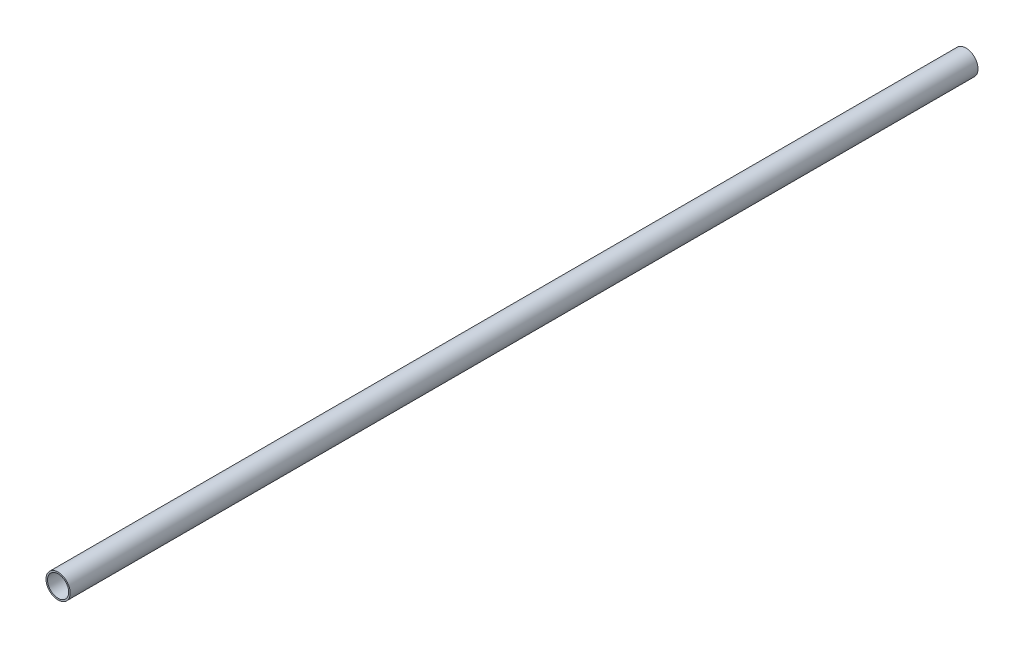
ISO-10303-21;
HEADER;
FILE_DESCRIPTION(('STEP AP214'),'2;1');
FILE_NAME('part.step','',(''),(''),'','','');
FILE_SCHEMA(('AUTOMOTIVE_DESIGN { 1 0 10303 214 1 1 1 1 }'));
ENDSEC;
DATA;
#1=APPLICATION_CONTEXT('core data for automotive mechanical design processes');
#2=APPLICATION_PROTOCOL_DEFINITION('international standard','automotive_design',2000,#1);
#3=PRODUCT_CONTEXT('',#1,'mechanical');
#4=PRODUCT('Part','Part','',(#3));
#5=PRODUCT_RELATED_PRODUCT_CATEGORY('part','',(#4));
#6=PRODUCT_DEFINITION_FORMATION('','',#4);
#7=PRODUCT_DEFINITION_CONTEXT('part definition',#1,'design');
#8=PRODUCT_DEFINITION('design','',#6,#7);
#9=PRODUCT_DEFINITION_SHAPE('','',#8);
#10=(LENGTH_UNIT() NAMED_UNIT(*) SI_UNIT(.MILLI.,.METRE.));
#11=(NAMED_UNIT(*) PLANE_ANGLE_UNIT() SI_UNIT($,.RADIAN.));
#12=(NAMED_UNIT(*) SI_UNIT($,.STERADIAN.) SOLID_ANGLE_UNIT());
#13=UNCERTAINTY_MEASURE_WITH_UNIT(LENGTH_MEASURE(1.E-05),#10,'distance_accuracy_value','');
#14=(GEOMETRIC_REPRESENTATION_CONTEXT(3) GLOBAL_UNCERTAINTY_ASSIGNED_CONTEXT((#13)) GLOBAL_UNIT_ASSIGNED_CONTEXT((#10,
#11,#12)) REPRESENTATION_CONTEXT('',''));
#15=CARTESIAN_POINT('',(0.,0.,0.));
#16=DIRECTION('',(0.,0.,1.));
#17=DIRECTION('',(1.,0.,0.));
#18=AXIS2_PLACEMENT_3D('',#15,#16,#17);
#19=CARTESIAN_POINT('',(0.,0.,600.));
#20=DIRECTION('',(0.,0.,1.));
#21=DIRECTION('',(1.,0.,0.));
#22=AXIS2_PLACEMENT_3D('',#19,#20,#21);
#23=PLANE('',#22);
#24=CARTESIAN_POINT('',(0.,0.,600.));
#25=DIRECTION('',(0.,0.,1.));
#26=DIRECTION('',(1.,0.,0.));
#27=AXIS2_PLACEMENT_3D('',#24,#25,#26);
#28=CIRCLE('',#27,8.);
#29=CARTESIAN_POINT('',(8.,0.,600.));
#30=VERTEX_POINT('',#29);
#31=EDGE_CURVE('E10',#30,#30,#28,.T.);
#32=ORIENTED_EDGE('',*,*,#31,.T.);
#33=EDGE_LOOP('',(#32));
#34=FACE_BOUND('',#33,.T.);
#35=CARTESIAN_POINT('',(0.,0.,600.));
#36=DIRECTION('',(0.,0.,1.));
#37=DIRECTION('',(1.,0.,0.));
#38=AXIS2_PLACEMENT_3D('',#35,#36,#37);
#39=CIRCLE('',#38,7.);
#40=CARTESIAN_POINT('',(7.,0.,600.));
#41=VERTEX_POINT('',#40);
#42=EDGE_CURVE('E48',#41,#41,#39,.T.);
#43=ORIENTED_EDGE('',*,*,#42,.F.);
#44=EDGE_LOOP('',(#43));
#45=FACE_BOUND('',#44,.T.);
#46=ADVANCED_FACE('F40',(#34,#45),#23,.T.);
#47=CARTESIAN_POINT('',(0.,0.,0.));
#48=DIRECTION('',(0.,0.,1.));
#49=DIRECTION('',(1.,0.,0.));
#50=AXIS2_PLACEMENT_3D('',#47,#48,#49);
#51=PLANE('',#50);
#52=CARTESIAN_POINT('',(0.,0.,0.));
#53=DIRECTION('',(0.,0.,1.));
#54=DIRECTION('',(1.,0.,0.));
#55=AXIS2_PLACEMENT_3D('',#52,#53,#54);
#56=CIRCLE('',#55,8.);
#57=CARTESIAN_POINT('',(8.,0.,0.));
#58=VERTEX_POINT('',#57);
#59=EDGE_CURVE('E41',#58,#58,#56,.T.);
#60=ORIENTED_EDGE('',*,*,#59,.F.);
#61=EDGE_LOOP('',(#60));
#62=FACE_BOUND('',#61,.T.);
#63=CARTESIAN_POINT('',(0.,0.,0.));
#64=DIRECTION('',(0.,0.,1.));
#65=DIRECTION('',(1.,0.,0.));
#66=AXIS2_PLACEMENT_3D('',#63,#64,#65);
#67=CIRCLE('',#66,7.);
#68=CARTESIAN_POINT('',(7.,0.,0.));
#69=VERTEX_POINT('',#68);
#70=EDGE_CURVE('E49',#69,#69,#67,.T.);
#71=ORIENTED_EDGE('',*,*,#70,.T.);
#72=EDGE_LOOP('',(#71));
#73=FACE_BOUND('',#72,.T.);
#74=ADVANCED_FACE('F58',(#62,#73),#51,.F.);
#75=CARTESIAN_POINT('',(0.,0.,600.));
#76=DIRECTION('',(0.,0.,-1.));
#77=DIRECTION('',(-1.,0.,0.));
#78=AXIS2_PLACEMENT_3D('',#75,#76,#77);
#79=CYLINDRICAL_SURFACE('',#78,8.);
#80=ORIENTED_EDGE('',*,*,#31,.F.);
#81=EDGE_LOOP('',(#80));
#82=FACE_BOUND('',#81,.T.);
#83=ORIENTED_EDGE('',*,*,#59,.T.);
#84=EDGE_LOOP('',(#83));
#85=FACE_BOUND('',#84,.T.);
#86=ADVANCED_FACE('F39',(#82,#85),#79,.T.);
#87=CARTESIAN_POINT('',(0.,0.,600.));
#88=DIRECTION('',(0.,0.,-1.));
#89=DIRECTION('',(-1.,0.,0.));
#90=AXIS2_PLACEMENT_3D('',#87,#88,#89);
#91=CYLINDRICAL_SURFACE('',#90,7.);
#92=ORIENTED_EDGE('',*,*,#42,.T.);
#93=EDGE_LOOP('',(#92));
#94=FACE_BOUND('',#93,.T.);
#95=ORIENTED_EDGE('',*,*,#70,.F.);
#96=EDGE_LOOP('',(#95));
#97=FACE_BOUND('',#96,.T.);
#98=ADVANCED_FACE('F57',(#94,#97),#91,.F.);
#99=CLOSED_SHELL('',(#46,#74,#86,#98));
#100=MANIFOLD_SOLID_BREP('B2',#99);
#101=ADVANCED_BREP_SHAPE_REPRESENTATION('',(#18,#100),#14);
#102=SHAPE_DEFINITION_REPRESENTATION(#9,#101);
ENDSEC;
END-ISO-10303-21;
